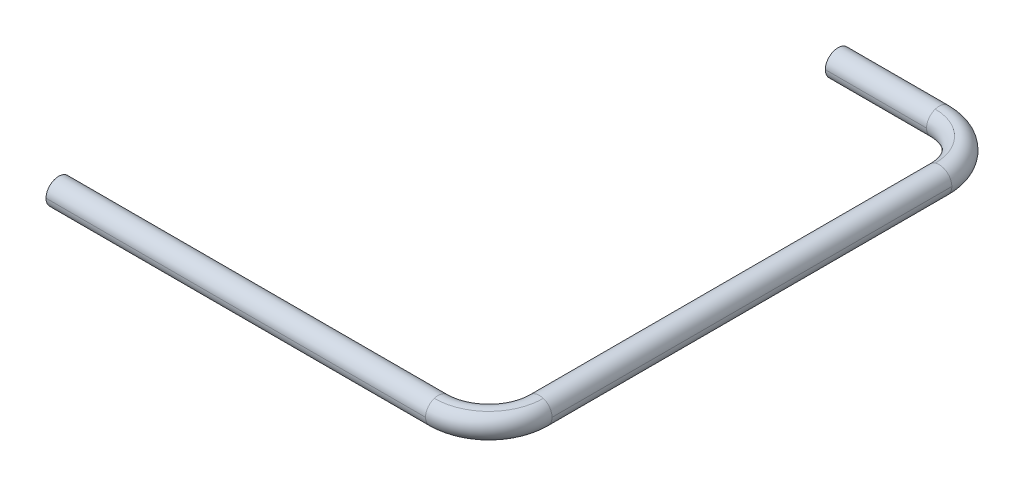
ISO-10303-21;
HEADER;
FILE_DESCRIPTION(('STEP AP214'),'2;1');
FILE_NAME('part.step','',(''),(''),'','','');
FILE_SCHEMA(('AUTOMOTIVE_DESIGN { 1 0 10303 214 1 1 1 1 }'));
ENDSEC;
DATA;
#1=APPLICATION_CONTEXT('core data for automotive mechanical design processes');
#2=APPLICATION_PROTOCOL_DEFINITION('international standard','automotive_design',2000,#1);
#3=PRODUCT_CONTEXT('',#1,'mechanical');
#4=PRODUCT('Part','Part','',(#3));
#5=PRODUCT_RELATED_PRODUCT_CATEGORY('part','',(#4));
#6=PRODUCT_DEFINITION_FORMATION('','',#4);
#7=PRODUCT_DEFINITION_CONTEXT('part definition',#1,'design');
#8=PRODUCT_DEFINITION('design','',#6,#7);
#9=PRODUCT_DEFINITION_SHAPE('','',#8);
#10=(LENGTH_UNIT() NAMED_UNIT(*) SI_UNIT(.MILLI.,.METRE.));
#11=(NAMED_UNIT(*) PLANE_ANGLE_UNIT() SI_UNIT($,.RADIAN.));
#12=(NAMED_UNIT(*) SI_UNIT($,.STERADIAN.) SOLID_ANGLE_UNIT());
#13=UNCERTAINTY_MEASURE_WITH_UNIT(LENGTH_MEASURE(1.E-05),#10,'distance_accuracy_value','');
#14=(GEOMETRIC_REPRESENTATION_CONTEXT(3) GLOBAL_UNCERTAINTY_ASSIGNED_CONTEXT((#13)) GLOBAL_UNIT_ASSIGNED_CONTEXT((#10,
#11,#12)) REPRESENTATION_CONTEXT('',''));
#15=CARTESIAN_POINT('',(0.,0.,0.));
#16=DIRECTION('',(0.,0.,1.));
#17=DIRECTION('',(1.,0.,0.));
#18=AXIS2_PLACEMENT_3D('',#15,#16,#17);
#19=CARTESIAN_POINT('',(0.,0.,0.));
#20=DIRECTION('',(1.,0.,0.));
#21=DIRECTION('',(0.,0.,-1.));
#22=AXIS2_PLACEMENT_3D('',#19,#20,#21);
#23=PLANE('',#22);
#24=CARTESIAN_POINT('',(0.,0.,0.));
#25=DIRECTION('',(1.,0.,0.));
#26=DIRECTION('',(0.,0.,-1.));
#27=AXIS2_PLACEMENT_3D('',#24,#25,#26);
#28=CIRCLE('',#27,2.5);
#29=CARTESIAN_POINT('',(0.,0.,2.5));
#30=VERTEX_POINT('',#29);
#31=CARTESIAN_POINT('',(0.,0.,-2.5));
#32=VERTEX_POINT('',#31);
#33=EDGE_CURVE('E11',#30,#32,#28,.T.);
#34=ORIENTED_EDGE('',*,*,#33,.F.);
#35=CARTESIAN_POINT('',(0.,0.,0.));
#36=DIRECTION('',(1.,0.,0.));
#37=DIRECTION('',(0.,0.,-1.));
#38=AXIS2_PLACEMENT_3D('',#35,#36,#37);
#39=CIRCLE('',#38,2.5);
#40=EDGE_CURVE('E25',#32,#30,#39,.T.);
#41=ORIENTED_EDGE('',*,*,#40,.F.);
#42=EDGE_LOOP('',(#34,#41));
#43=FACE_BOUND('',#42,.T.);
#44=ADVANCED_FACE('F17',(#43),#23,.F.);
#45=CARTESIAN_POINT('',(20.,0.,0.));
#46=DIRECTION('',(1.,0.,0.));
#47=DIRECTION('',(0.,-1.,0.));
#48=AXIS2_PLACEMENT_3D('',#45,#46,#47);
#49=CYLINDRICAL_SURFACE('',#48,2.5);
#50=DIRECTION('',(1.,0.,0.));
#51=VECTOR('',#50,1.);
#52=CARTESIAN_POINT('',(0.,0.,2.5));
#53=LINE('',#52,#51);
#54=CARTESIAN_POINT('',(20.,0.,2.5));
#55=VERTEX_POINT('',#54);
#56=EDGE_CURVE('E210',#30,#55,#53,.T.);
#57=ORIENTED_EDGE('',*,*,#56,.T.);
#58=CARTESIAN_POINT('',(20.,0.,0.));
#59=DIRECTION('',(1.,0.,0.));
#60=DIRECTION('',(0.,0.,-1.));
#61=AXIS2_PLACEMENT_3D('',#58,#59,#60);
#62=CIRCLE('',#61,2.5);
#63=CARTESIAN_POINT('',(20.,2.37764129073788,0.772542485937368));
#64=VERTEX_POINT('',#63);
#65=EDGE_CURVE('E205',#64,#55,#62,.T.);
#66=ORIENTED_EDGE('',*,*,#65,.F.);
#67=CARTESIAN_POINT('',(20.,0.,0.));
#68=DIRECTION('',(1.,0.,0.));
#69=DIRECTION('',(0.,0.,-1.));
#70=AXIS2_PLACEMENT_3D('',#67,#68,#69);
#71=CIRCLE('',#70,2.5);
#72=CARTESIAN_POINT('',(20.,0.,-2.5));
#73=VERTEX_POINT('',#72);
#74=EDGE_CURVE('E200',#73,#64,#71,.T.);
#75=ORIENTED_EDGE('',*,*,#74,.F.);
#76=DIRECTION('',(1.,0.,0.));
#77=VECTOR('',#76,1.);
#78=CARTESIAN_POINT('',(0.,0.,-2.5));
#79=LINE('',#78,#77);
#80=EDGE_CURVE('E195',#32,#73,#79,.T.);
#81=ORIENTED_EDGE('',*,*,#80,.F.);
#82=ORIENTED_EDGE('',*,*,#40,.T.);
#83=EDGE_LOOP('',(#57,#66,#75,#81,#82));
#84=FACE_BOUND('',#83,.T.);
#85=ADVANCED_FACE('F219',(#84),#49,.T.);
#86=CARTESIAN_POINT('',(20.,0.,0.));
#87=DIRECTION('',(1.,0.,0.));
#88=DIRECTION('',(0.,1.,0.));
#89=AXIS2_PLACEMENT_3D('',#86,#87,#88);
#90=CYLINDRICAL_SURFACE('',#89,2.5);
#91=ORIENTED_EDGE('',*,*,#56,.F.);
#92=ORIENTED_EDGE('',*,*,#33,.T.);
#93=ORIENTED_EDGE('',*,*,#80,.T.);
#94=CARTESIAN_POINT('',(20.,0.,0.));
#95=DIRECTION('',(1.,0.,0.));
#96=DIRECTION('',(0.,0.,-1.));
#97=AXIS2_PLACEMENT_3D('',#94,#95,#96);
#98=CIRCLE('',#97,2.5);
#99=CARTESIAN_POINT('',(20.,-2.37764129073788,-0.772542485937368));
#100=VERTEX_POINT('',#99);
#101=EDGE_CURVE('E190',#100,#73,#98,.T.);
#102=ORIENTED_EDGE('',*,*,#101,.F.);
#103=CARTESIAN_POINT('',(20.,0.,0.));
#104=DIRECTION('',(1.,0.,0.));
#105=DIRECTION('',(0.,0.,-1.));
#106=AXIS2_PLACEMENT_3D('',#103,#104,#105);
#107=CIRCLE('',#106,2.5);
#108=EDGE_CURVE('E186',#55,#100,#107,.T.);
#109=ORIENTED_EDGE('',*,*,#108,.F.);
#110=EDGE_LOOP('',(#91,#92,#93,#102,#109));
#111=FACE_BOUND('',#110,.T.);
#112=ADVANCED_FACE('F164',(#111),#90,.T.);
#113=CARTESIAN_POINT('',(20.,0.,10.));
#114=DIRECTION('',(0.,-1.,0.));
#115=DIRECTION('',(-0.707106781186548,0.,0.707106781186547));
#116=AXIS2_PLACEMENT_3D('',#113,#114,#115);
#117=TOROIDAL_SURFACE('',#116,10.,2.5);
#118=CARTESIAN_POINT('',(20.,2.37764129073788,10.));
#119=DIRECTION('',(0.,-1.,0.));
#120=DIRECTION('',(0.,0.,-1.));
#121=AXIS2_PLACEMENT_3D('',#118,#119,#120);
#122=CIRCLE('',#121,9.22745751406263);
#123=CARTESIAN_POINT('',(29.2274575140626,2.37764129073788,10.));
#124=VERTEX_POINT('',#123);
#125=EDGE_CURVE('E183',#64,#124,#122,.T.);
#126=ORIENTED_EDGE('',*,*,#125,.F.);
#127=ORIENTED_EDGE('',*,*,#65,.T.);
#128=ORIENTED_EDGE('',*,*,#108,.T.);
#129=CARTESIAN_POINT('',(20.,-2.37764129073788,-0.77254248593737));
#130=CARTESIAN_POINT('',(20.1762654922407,-2.37764129073788,-0.772546224965947));
#131=CARTESIAN_POINT('',(20.3525306663267,-2.37764129073788,-0.768216417356454));
#132=CARTESIAN_POINT('',(20.7046365464299,-2.37764129073788,-0.75091655610638));
#133=CARTESIAN_POINT('',(20.8804772524471,-2.37764129073788,-0.737946502465801));
#134=CARTESIAN_POINT('',(21.2313103646535,-2.37764129073788,-0.703392996398611));
#135=CARTESIAN_POINT('',(21.4063027708426,-2.37764129073788,-0.681809543972001));
#136=CARTESIAN_POINT('',(21.7550177692617,-2.37764129073788,-0.630082415401696));
#137=CARTESIAN_POINT('',(21.9287403614916,-2.37764129073788,-0.599938739258002));
#138=CARTESIAN_POINT('',(22.2744972035363,-2.37764129073788,-0.531163466193579));
#139=CARTESIAN_POINT('',(22.446531453351,-2.37764129073788,-0.492531869272851));
#140=CARTESIAN_POINT('',(22.7884971691463,-2.37764129073788,-0.406873906177727));
#141=CARTESIAN_POINT('',(22.9584286351268,-2.37764129073788,-0.359847540003329));
#142=CARTESIAN_POINT('',(23.2957794023539,-2.37764129073788,-0.257513306361434));
#143=CARTESIAN_POINT('',(23.4631987036005,-2.37764129073788,-0.202205438893935));
#144=CARTESIAN_POINT('',(23.7951218138974,-2.37764129073788,-0.0834414502385951));
#145=CARTESIAN_POINT('',(23.9596256229476,-2.37764129073788,-0.0199853290507542));
#146=CARTESIAN_POINT('',(24.285321444687,-2.37764129073788,0.11492229731919));
#147=CARTESIAN_POINT('',(24.4465134573761,-2.37764129073788,0.186373802501294));
#148=CARTESIAN_POINT('',(24.7651973607372,-2.37764129073788,0.337100063489158));
#149=CARTESIAN_POINT('',(24.9226892514093,-2.37764129073788,0.416374819294919));
#150=CARTESIAN_POINT('',(25.2335934989713,-2.37764129073788,0.582556601816592));
#151=CARTESIAN_POINT('',(25.3870058558613,-2.37764129073788,0.669463628532504));
#152=CARTESIAN_POINT('',(25.6893814520557,-2.37764129073788,0.85070058620365));
#153=CARTESIAN_POINT('',(25.83834469136,-2.37764129073788,0.945030517158884));
#154=CARTESIAN_POINT('',(26.1314631868916,-2.37764129073788,1.14088603425106));
#155=CARTESIAN_POINT('',(26.2756184431188,-2.37764129073788,1.24241162038801));
#156=CARTESIAN_POINT('',(26.5587736898574,-2.37764129073788,1.45241386381177));
#157=CARTESIAN_POINT('',(26.6977736803688,-2.37764129073788,1.56089052109859));
#158=CARTESIAN_POINT('',(26.9702835325237,-2.37764129073788,1.78453357705386));
#159=CARTESIAN_POINT('',(27.1037933941671,-2.37764129073788,1.89969997572231));
#160=CARTESIAN_POINT('',(27.3650013516353,-2.37764129073788,2.13644506849892));
#161=CARTESIAN_POINT('',(27.4926994474601,-2.37764129073788,2.25802376260707));
#162=CARTESIAN_POINT('',(27.741976237393,-2.37764129073788,2.50730055253996));
#163=CARTESIAN_POINT('',(27.8635549315011,-2.37764129073788,2.63499864836471));
#164=CARTESIAN_POINT('',(28.1003000242777,-2.37764129073788,2.89620660583292));
#165=CARTESIAN_POINT('',(28.2154664229462,-2.37764129073788,3.02971646747638));
#166=CARTESIAN_POINT('',(28.4391094789014,-2.37764129073788,3.30222631963124));
#167=CARTESIAN_POINT('',(28.5475861361883,-2.37764129073788,3.44122631014264));
#168=CARTESIAN_POINT('',(28.757588379612,-2.37764129073788,3.72438155688124));
#169=CARTESIAN_POINT('',(28.859113965749,-2.37764129073788,3.86853681310845));
#170=CARTESIAN_POINT('',(29.0549694828411,-2.37764129073788,4.16165530864002));
#171=CARTESIAN_POINT('',(29.1492994137964,-2.37764129073788,4.31061854794438));
#172=CARTESIAN_POINT('',(29.3305363714675,-2.37764129073788,4.61299414413872));
#173=CARTESIAN_POINT('',(29.4174433981834,-2.37764129073788,4.7664065010287));
#174=CARTESIAN_POINT('',(29.5836251807051,-2.37764129073788,5.07731074859074));
#175=CARTESIAN_POINT('',(29.6628999365109,-2.37764129073788,5.2348026392628));
#176=CARTESIAN_POINT('',(29.8136261974987,-2.37764129073788,5.55348654262397));
#177=CARTESIAN_POINT('',(29.8850777026808,-2.37764129073788,5.71467855531307));
#178=CARTESIAN_POINT('',(30.0199853290508,-2.37764129073788,6.04037437705243));
#179=CARTESIAN_POINT('',(30.0834414502386,-2.37764129073788,6.20487818610269));
#180=CARTESIAN_POINT('',(30.202205438894,-2.37764129073788,6.53680129639955));
#181=CARTESIAN_POINT('',(30.2575133063614,-2.37764129073788,6.70422059764615));
#182=CARTESIAN_POINT('',(30.3598475400033,-2.37764129073788,7.04157136487327));
#183=CARTESIAN_POINT('',(30.4068739061777,-2.37764129073788,7.21150283085379));
#184=CARTESIAN_POINT('',(30.4925318692729,-2.37764129073788,7.55346854664903));
#185=CARTESIAN_POINT('',(30.5311634661936,-2.37764129073788,7.72550279646375));
#186=CARTESIAN_POINT('',(30.599938739258,-2.37764129073788,8.07125963850841));
#187=CARTESIAN_POINT('',(30.6300824154017,-2.37764129073788,8.24498223073835));
#188=CARTESIAN_POINT('',(30.681809543972,-2.37764129073788,8.59369722915742));
#189=CARTESIAN_POINT('',(30.7033929963986,-2.37764129073788,8.76868963534656));
#190=CARTESIAN_POINT('',(30.7379465024658,-2.37764129073788,9.11952274755293));
#191=CARTESIAN_POINT('',(30.7509165561064,-2.37764129073788,9.29536345357016));
#192=CARTESIAN_POINT('',(30.7682164173565,-2.37764129073788,9.64746933367338));
#193=CARTESIAN_POINT('',(30.7725462249659,-2.37764129073788,9.82373450775935));
#194=CARTESIAN_POINT('',(30.7725424859374,-2.37764129073788,10.));
#195=B_SPLINE_CURVE_WITH_KNOTS('',3,(#129,#130,#131,#132,#133,#134,#135,#136,#137,#138,#139,
#140,#141,#142,#143,#144,#145,#146,#147,#148,#149,#150,#151,#152,#153,#154,#155,#156,#157,#158,
#159,#160,#161,#162,#163,#164,#165,#166,#167,#168,#169,#170,#171,#172,#173,#174,#175,#176,#177,
#178,#179,#180,#181,#182,#183,#184,#185,#186,#187,#188,#189,#190,#191,#192,#193,#194),
.UNSPECIFIED.,.F.,.F.,(4,2,2,2,2,2,2,2,2,2,2,2,2,2,2,2,2,2,2,2,2,2,2,2,2,2,2,2,2,2,2,2,4),(0.,
0.528742853840341,1.05748570768068,1.58622856152102,2.11497141536136,2.64371426920171,
3.17245712304205,3.70119997688239,4.22994283072273,4.75868568456307,5.28742853840341,
5.81617139224375,6.3449142460841,6.87365709992443,7.40239995376478,7.93114280760512,
8.45988566144546,8.9886285152858,9.51737136912614,10.0461142229665,10.5748570768068,
11.1035999306472,11.6323427844875,12.1610856383278,12.6898284921682,13.2185713460085,
13.7473141998489,14.2760570536892,14.8047999075295,15.3335427613699,15.8622856152102,
16.3910284690506,16.9197713228909),.UNSPECIFIED.);
#196=CARTESIAN_POINT('',(30.7725424859374,-2.37764129073788,10.));
#197=VERTEX_POINT('',#196);
#198=EDGE_CURVE('E181',#100,#197,#195,.T.);
#199=ORIENTED_EDGE('',*,*,#198,.T.);
#200=CARTESIAN_POINT('',(30.,0.,10.));
#201=DIRECTION('',(0.,0.,1.));
#202=DIRECTION('',(1.,0.,0.));
#203=AXIS2_PLACEMENT_3D('',#200,#201,#202);
#204=CIRCLE('',#203,2.5);
#205=CARTESIAN_POINT('',(27.5,0.,10.));
#206=VERTEX_POINT('',#205);
#207=EDGE_CURVE('E233',#206,#197,#204,.T.);
#208=ORIENTED_EDGE('',*,*,#207,.F.);
#209=CARTESIAN_POINT('',(30.,0.,10.));
#210=DIRECTION('',(0.,0.,1.));
#211=DIRECTION('',(1.,0.,0.));
#212=AXIS2_PLACEMENT_3D('',#209,#210,#211);
#213=CIRCLE('',#212,2.5);
#214=EDGE_CURVE('E224',#124,#206,#213,.T.);
#215=ORIENTED_EDGE('',*,*,#214,.F.);
#216=EDGE_LOOP('',(#126,#127,#128,#199,#208,#215));
#217=FACE_BOUND('',#216,.T.);
#218=ADVANCED_FACE('F159',(#217),#117,.T.);
#219=CARTESIAN_POINT('',(30.,0.,10.));
#220=DIRECTION('',(0.,0.,-1.));
#221=DIRECTION('',(0.,-1.,0.));
#222=AXIS2_PLACEMENT_3D('',#219,#220,#221);
#223=CYLINDRICAL_SURFACE('',#222,2.5);
#224=DIRECTION('',(0.,0.,-1.));
#225=VECTOR('',#224,1.);
#226=CARTESIAN_POINT('',(32.5,0.,89.));
#227=LINE('',#226,#225);
#228=CARTESIAN_POINT('',(32.5,0.,89.));
#229=VERTEX_POINT('',#228);
#230=CARTESIAN_POINT('',(32.5,0.,10.));
#231=VERTEX_POINT('',#230);
#232=EDGE_CURVE('E409',#229,#231,#227,.T.);
#233=ORIENTED_EDGE('',*,*,#232,.T.);
#234=CARTESIAN_POINT('',(30.,0.,10.));
#235=DIRECTION('',(0.,0.,1.));
#236=DIRECTION('',(1.,0.,0.));
#237=AXIS2_PLACEMENT_3D('',#234,#235,#236);
#238=CIRCLE('',#237,2.5);
#239=EDGE_CURVE('E405',#231,#124,#238,.T.);
#240=ORIENTED_EDGE('',*,*,#239,.T.);
#241=ORIENTED_EDGE('',*,*,#214,.T.);
#242=DIRECTION('',(0.,0.,-1.));
#243=VECTOR('',#242,1.);
#244=CARTESIAN_POINT('',(27.5,0.,89.));
#245=LINE('',#244,#243);
#246=CARTESIAN_POINT('',(27.5,0.,89.));
#247=VERTEX_POINT('',#246);
#248=EDGE_CURVE('E400',#247,#206,#245,.T.);
#249=ORIENTED_EDGE('',*,*,#248,.F.);
#250=CARTESIAN_POINT('',(30.,0.,89.));
#251=DIRECTION('',(0.,0.,-1.));
#252=DIRECTION('',(-1.,0.,0.));
#253=AXIS2_PLACEMENT_3D('',#250,#251,#252);
#254=CIRCLE('',#253,2.5);
#255=CARTESIAN_POINT('',(30.7725424859374,2.37764129073788,89.));
#256=VERTEX_POINT('',#255);
#257=EDGE_CURVE('E396',#247,#256,#254,.T.);
#258=ORIENTED_EDGE('',*,*,#257,.T.);
#259=CARTESIAN_POINT('',(30.,0.,89.));
#260=DIRECTION('',(0.,0.,-1.));
#261=DIRECTION('',(-1.,0.,0.));
#262=AXIS2_PLACEMENT_3D('',#259,#260,#261);
#263=CIRCLE('',#262,2.5);
#264=EDGE_CURVE('E384',#256,#229,#263,.T.);
#265=ORIENTED_EDGE('',*,*,#264,.T.);
#266=EDGE_LOOP('',(#233,#240,#241,#249,#258,#265));
#267=FACE_BOUND('',#266,.T.);
#268=ADVANCED_FACE('F154',(#267),#223,.T.);
#269=CARTESIAN_POINT('',(20.,0.,89.));
#270=DIRECTION('',(0.,1.,0.));
#271=DIRECTION('',(-0.707106781186547,0.,-0.707106781186548));
#272=AXIS2_PLACEMENT_3D('',#269,#270,#271);
#273=TOROIDAL_SURFACE('',#272,10.,2.5);
#274=CARTESIAN_POINT('',(20.,-2.37764129073788,89.));
#275=DIRECTION('',(0.,1.,0.));
#276=DIRECTION('',(0.,0.,1.));
#277=AXIS2_PLACEMENT_3D('',#274,#275,#276);
#278=CIRCLE('',#277,9.22745751406264);
#279=CARTESIAN_POINT('',(20.,-2.37764129073788,98.2274575140626));
#280=VERTEX_POINT('',#279);
#281=CARTESIAN_POINT('',(29.2274575140626,-2.37764129073788,89.));
#282=VERTEX_POINT('',#281);
#283=EDGE_CURVE('E115',#280,#282,#278,.T.);
#284=ORIENTED_EDGE('',*,*,#283,.T.);
#285=CARTESIAN_POINT('',(30.,0.,89.));
#286=DIRECTION('',(0.,0.,-1.));
#287=DIRECTION('',(-1.,0.,0.));
#288=AXIS2_PLACEMENT_3D('',#285,#286,#287);
#289=CIRCLE('',#288,2.5);
#290=EDGE_CURVE('E386',#229,#282,#289,.T.);
#291=ORIENTED_EDGE('',*,*,#290,.F.);
#292=ORIENTED_EDGE('',*,*,#264,.F.);
#293=CARTESIAN_POINT('',(20.,2.37764129073788,99.7725424859374));
#294=CARTESIAN_POINT('',(20.1762654922407,2.37764129073788,99.772546224966));
#295=CARTESIAN_POINT('',(20.3525306663267,2.37764129073788,99.7682164173564));
#296=CARTESIAN_POINT('',(20.7046365464299,2.37764129073788,99.7509165561064));
#297=CARTESIAN_POINT('',(20.8804772524471,2.37764129073788,99.7379465024658));
#298=CARTESIAN_POINT('',(21.2313103646535,2.37764129073788,99.7033929963986));
#299=CARTESIAN_POINT('',(21.4063027708426,2.37764129073788,99.681809543972));
#300=CARTESIAN_POINT('',(21.7550177692617,2.37764129073788,99.6300824154017));
#301=CARTESIAN_POINT('',(21.9287403614916,2.37764129073788,99.599938739258));
#302=CARTESIAN_POINT('',(22.2744972035363,2.37764129073788,99.5311634661936));
#303=CARTESIAN_POINT('',(22.446531453351,2.37764129073788,99.4925318692728));
#304=CARTESIAN_POINT('',(22.7884971691463,2.37764129073788,99.4068739061777));
#305=CARTESIAN_POINT('',(22.9584286351268,2.37764129073788,99.3598475400033));
#306=CARTESIAN_POINT('',(23.2957794023539,2.37764129073788,99.2575133063614));
#307=CARTESIAN_POINT('',(23.4631987036005,2.37764129073788,99.2022054388939));
#308=CARTESIAN_POINT('',(23.7951218138973,2.37764129073788,99.0834414502386));
#309=CARTESIAN_POINT('',(23.9596256229476,2.37764129073788,99.0199853290508));
#310=CARTESIAN_POINT('',(24.285321444687,2.37764129073788,98.8850777026808));
#311=CARTESIAN_POINT('',(24.4465134573761,2.37764129073788,98.8136261974987));
#312=CARTESIAN_POINT('',(24.7651973607372,2.37764129073788,98.6628999365108));
#313=CARTESIAN_POINT('',(24.9226892514093,2.37764129073788,98.5836251807051));
#314=CARTESIAN_POINT('',(25.2335934989713,2.37764129073788,98.4174433981834));
#315=CARTESIAN_POINT('',(25.3870058558613,2.37764129073788,98.3305363714675));
#316=CARTESIAN_POINT('',(25.6893814520557,2.37764129073788,98.1492994137964));
#317=CARTESIAN_POINT('',(25.83834469136,2.37764129073788,98.0549694828411));
#318=CARTESIAN_POINT('',(26.1314631868916,2.37764129073788,97.8591139657489));
#319=CARTESIAN_POINT('',(26.2756184431188,2.37764129073788,97.757588379612));
#320=CARTESIAN_POINT('',(26.5587736898574,2.37764129073788,97.5475861361882));
#321=CARTESIAN_POINT('',(26.6977736803688,2.37764129073788,97.4391094789014));
#322=CARTESIAN_POINT('',(26.9702835325237,2.37764129073788,97.2154664229461));
#323=CARTESIAN_POINT('',(27.1037933941671,2.37764129073788,97.1003000242777));
#324=CARTESIAN_POINT('',(27.3650013516353,2.37764129073788,96.8635549315011));
#325=CARTESIAN_POINT('',(27.4926994474601,2.37764129073788,96.7419762373929));
#326=CARTESIAN_POINT('',(27.741976237393,2.37764129073788,96.49269944746));
#327=CARTESIAN_POINT('',(27.8635549315011,2.37764129073788,96.3650013516353));
#328=CARTESIAN_POINT('',(28.1003000242777,2.37764129073788,96.1037933941671));
#329=CARTESIAN_POINT('',(28.2154664229462,2.37764129073788,95.9702835325236));
#330=CARTESIAN_POINT('',(28.4391094789014,2.37764129073788,95.6977736803688));
#331=CARTESIAN_POINT('',(28.5475861361883,2.37764129073788,95.5587736898574));
#332=CARTESIAN_POINT('',(28.757588379612,2.37764129073788,95.2756184431188));
#333=CARTESIAN_POINT('',(28.859113965749,2.37764129073788,95.1314631868916));
#334=CARTESIAN_POINT('',(29.0549694828411,2.37764129073788,94.83834469136));
#335=CARTESIAN_POINT('',(29.1492994137964,2.37764129073788,94.6893814520556));
#336=CARTESIAN_POINT('',(29.3305363714675,2.37764129073788,94.3870058558613));
#337=CARTESIAN_POINT('',(29.4174433981834,2.37764129073788,94.2335934989713));
#338=CARTESIAN_POINT('',(29.5836251807051,2.37764129073788,93.9226892514093));
#339=CARTESIAN_POINT('',(29.6628999365109,2.37764129073788,93.7651973607372));
#340=CARTESIAN_POINT('',(29.8136261974987,2.37764129073788,93.446513457376));
#341=CARTESIAN_POINT('',(29.8850777026808,2.37764129073788,93.2853214446869));
#342=CARTESIAN_POINT('',(30.0199853290508,2.37764129073788,92.9596256229476));
#343=CARTESIAN_POINT('',(30.0834414502386,2.37764129073788,92.7951218138973));
#344=CARTESIAN_POINT('',(30.2022054388939,2.37764129073788,92.4631987036005));
#345=CARTESIAN_POINT('',(30.2575133063614,2.37764129073788,92.2957794023539));
#346=CARTESIAN_POINT('',(30.3598475400033,2.37764129073788,91.9584286351267));
#347=CARTESIAN_POINT('',(30.4068739061777,2.37764129073788,91.7884971691462));
#348=CARTESIAN_POINT('',(30.4925318692729,2.37764129073788,91.446531453351));
#349=CARTESIAN_POINT('',(30.5311634661936,2.37764129073788,91.2744972035363));
#350=CARTESIAN_POINT('',(30.599938739258,2.37764129073788,90.9287403614916));
#351=CARTESIAN_POINT('',(30.6300824154017,2.37764129073788,90.7550177692617));
#352=CARTESIAN_POINT('',(30.681809543972,2.37764129073788,90.4063027708426));
#353=CARTESIAN_POINT('',(30.7033929963986,2.37764129073788,90.2313103646534));
#354=CARTESIAN_POINT('',(30.7379465024658,2.37764129073788,89.8804772524471));
#355=CARTESIAN_POINT('',(30.7509165561064,2.37764129073788,89.7046365464299));
#356=CARTESIAN_POINT('',(30.7682164173565,2.37764129073788,89.3525306663266));
#357=CARTESIAN_POINT('',(30.7725462249659,2.37764129073788,89.1762654922407));
#358=CARTESIAN_POINT('',(30.7725424859374,2.37764129073788,89.));
#359=B_SPLINE_CURVE_WITH_KNOTS('',3,(#293,#294,#295,#296,#297,#298,#299,#300,#301,#302,#303,
#304,#305,#306,#307,#308,#309,#310,#311,#312,#313,#314,#315,#316,#317,#318,#319,#320,#321,#322,
#323,#324,#325,#326,#327,#328,#329,#330,#331,#332,#333,#334,#335,#336,#337,#338,#339,#340,#341,
#342,#343,#344,#345,#346,#347,#348,#349,#350,#351,#352,#353,#354,#355,#356,#357,#358),
.UNSPECIFIED.,.F.,.F.,(4,2,2,2,2,2,2,2,2,2,2,2,2,2,2,2,2,2,2,2,2,2,2,2,2,2,2,2,2,2,2,2,4),(0.,
0.528742853840341,1.05748570768068,1.58622856152103,2.11497141536136,2.6437142692017,
3.17245712304204,3.70119997688238,4.22994283072272,4.75868568456306,5.2874285384034,
5.81617139224375,6.34491424608409,6.87365709992443,7.40239995376477,7.9311428076051,
8.45988566144544,8.98862851528579,9.51737136912612,10.0461142229665,10.5748570768068,
11.1035999306472,11.6323427844875,12.1610856383278,12.6898284921682,13.2185713460085,
13.7473141998488,14.2760570536892,14.8047999075295,15.3335427613699,15.8622856152102,
16.3910284690505,16.9197713228909),.UNSPECIFIED.);
#360=CARTESIAN_POINT('',(20.,2.37764129073788,99.7725424859374));
#361=VERTEX_POINT('',#360);
#362=EDGE_CURVE('E136',#361,#256,#359,.T.);
#363=ORIENTED_EDGE('',*,*,#362,.F.);
#364=CARTESIAN_POINT('',(20.,0.,99.));
#365=DIRECTION('',(1.,0.,0.));
#366=DIRECTION('',(0.,0.,-1.));
#367=AXIS2_PLACEMENT_3D('',#364,#365,#366);
#368=CIRCLE('',#367,2.5);
#369=CARTESIAN_POINT('',(20.,0.,101.5));
#370=VERTEX_POINT('',#369);
#371=EDGE_CURVE('E108',#361,#370,#368,.T.);
#372=ORIENTED_EDGE('',*,*,#371,.T.);
#373=CARTESIAN_POINT('',(20.,0.,99.));
#374=DIRECTION('',(1.,0.,0.));
#375=DIRECTION('',(0.,0.,-1.));
#376=AXIS2_PLACEMENT_3D('',#373,#374,#375);
#377=CIRCLE('',#376,2.5);
#378=EDGE_CURVE('E129',#370,#280,#377,.T.);
#379=ORIENTED_EDGE('',*,*,#378,.T.);
#380=EDGE_LOOP('',(#284,#291,#292,#363,#372,#379));
#381=FACE_BOUND('',#380,.T.);
#382=ADVANCED_FACE('F144',(#381),#273,.T.);
#383=CARTESIAN_POINT('',(20.,0.,99.));
#384=DIRECTION('',(1.,0.,0.));
#385=DIRECTION('',(0.,1.,0.));
#386=AXIS2_PLACEMENT_3D('',#383,#384,#385);
#387=CYLINDRICAL_SURFACE('',#386,2.5);
#388=DIRECTION('',(1.,0.,0.));
#389=VECTOR('',#388,1.);
#390=CARTESIAN_POINT('',(-55.,0.,101.5));
#391=LINE('',#390,#389);
#392=CARTESIAN_POINT('',(-55.,0.,101.5));
#393=VERTEX_POINT('',#392);
#394=EDGE_CURVE('E125',#393,#370,#391,.T.);
#395=ORIENTED_EDGE('',*,*,#394,.F.);
#396=CARTESIAN_POINT('',(-55.,0.,99.));
#397=DIRECTION('',(1.,0.,0.));
#398=DIRECTION('',(0.,0.,-1.));
#399=AXIS2_PLACEMENT_3D('',#396,#397,#398);
#400=CIRCLE('',#399,2.5);
#401=CARTESIAN_POINT('',(-55.,0.,96.5));
#402=VERTEX_POINT('',#401);
#403=EDGE_CURVE('E98',#393,#402,#400,.T.);
#404=ORIENTED_EDGE('',*,*,#403,.T.);
#405=DIRECTION('',(1.,0.,0.));
#406=VECTOR('',#405,1.);
#407=CARTESIAN_POINT('',(-55.,0.,96.5));
#408=LINE('',#407,#406);
#409=CARTESIAN_POINT('',(20.,0.,96.5));
#410=VERTEX_POINT('',#409);
#411=EDGE_CURVE('E90',#402,#410,#408,.T.);
#412=ORIENTED_EDGE('',*,*,#411,.T.);
#413=CARTESIAN_POINT('',(20.,0.,99.));
#414=DIRECTION('',(1.,0.,0.));
#415=DIRECTION('',(0.,0.,-1.));
#416=AXIS2_PLACEMENT_3D('',#413,#414,#415);
#417=CIRCLE('',#416,2.5);
#418=EDGE_CURVE('E95',#280,#410,#417,.T.);
#419=ORIENTED_EDGE('',*,*,#418,.F.);
#420=ORIENTED_EDGE('',*,*,#378,.F.);
#421=EDGE_LOOP('',(#395,#404,#412,#419,#420));
#422=FACE_BOUND('',#421,.T.);
#423=ADVANCED_FACE('F92',(#422),#387,.T.);
#424=CARTESIAN_POINT('',(20.,0.,89.));
#425=DIRECTION('',(0.,1.,0.));
#426=DIRECTION('',(-0.707106781186547,0.,-0.707106781186548));
#427=AXIS2_PLACEMENT_3D('',#424,#425,#426);
#428=TOROIDAL_SURFACE('',#427,10.,2.5);
#429=ORIENTED_EDGE('',*,*,#283,.F.);
#430=ORIENTED_EDGE('',*,*,#418,.T.);
#431=CARTESIAN_POINT('',(20.,0.,99.));
#432=DIRECTION('',(1.,0.,0.));
#433=DIRECTION('',(0.,0.,-1.));
#434=AXIS2_PLACEMENT_3D('',#431,#432,#433);
#435=CIRCLE('',#434,2.5);
#436=EDGE_CURVE('E105',#410,#361,#435,.T.);
#437=ORIENTED_EDGE('',*,*,#436,.T.);
#438=ORIENTED_EDGE('',*,*,#362,.T.);
#439=ORIENTED_EDGE('',*,*,#257,.F.);
#440=CARTESIAN_POINT('',(30.,0.,89.));
#441=DIRECTION('',(0.,0.,-1.));
#442=DIRECTION('',(-1.,0.,0.));
#443=AXIS2_PLACEMENT_3D('',#440,#441,#442);
#444=CIRCLE('',#443,2.5);
#445=EDGE_CURVE('E111',#282,#247,#444,.T.);
#446=ORIENTED_EDGE('',*,*,#445,.F.);
#447=EDGE_LOOP('',(#429,#430,#437,#438,#439,#446));
#448=FACE_BOUND('',#447,.T.);
#449=ADVANCED_FACE('F113',(#448),#428,.T.);
#450=CARTESIAN_POINT('',(30.,0.,10.));
#451=DIRECTION('',(0.,0.,-1.));
#452=DIRECTION('',(0.,1.,0.));
#453=AXIS2_PLACEMENT_3D('',#450,#451,#452);
#454=CYLINDRICAL_SURFACE('',#453,2.5);
#455=ORIENTED_EDGE('',*,*,#232,.F.);
#456=ORIENTED_EDGE('',*,*,#290,.T.);
#457=ORIENTED_EDGE('',*,*,#445,.T.);
#458=ORIENTED_EDGE('',*,*,#248,.T.);
#459=ORIENTED_EDGE('',*,*,#207,.T.);
#460=CARTESIAN_POINT('',(30.,0.,10.));
#461=DIRECTION('',(0.,0.,1.));
#462=DIRECTION('',(1.,0.,0.));
#463=AXIS2_PLACEMENT_3D('',#460,#461,#462);
#464=CIRCLE('',#463,2.5);
#465=EDGE_CURVE('E231',#197,#231,#464,.T.);
#466=ORIENTED_EDGE('',*,*,#465,.T.);
#467=EDGE_LOOP('',(#455,#456,#457,#458,#459,#466));
#468=FACE_BOUND('',#467,.T.);
#469=ADVANCED_FACE('F259',(#468),#454,.T.);
#470=CARTESIAN_POINT('',(20.,0.,10.));
#471=DIRECTION('',(0.,-1.,0.));
#472=DIRECTION('',(-0.707106781186548,0.,0.707106781186547));
#473=AXIS2_PLACEMENT_3D('',#470,#471,#472);
#474=TOROIDAL_SURFACE('',#473,10.,2.5);
#475=ORIENTED_EDGE('',*,*,#125,.T.);
#476=ORIENTED_EDGE('',*,*,#239,.F.);
#477=ORIENTED_EDGE('',*,*,#465,.F.);
#478=ORIENTED_EDGE('',*,*,#198,.F.);
#479=ORIENTED_EDGE('',*,*,#101,.T.);
#480=ORIENTED_EDGE('',*,*,#74,.T.);
#481=EDGE_LOOP('',(#475,#476,#477,#478,#479,#480));
#482=FACE_BOUND('',#481,.T.);
#483=ADVANCED_FACE('F228',(#482),#474,.T.);
#484=CARTESIAN_POINT('',(20.,0.,99.));
#485=DIRECTION('',(1.,0.,0.));
#486=DIRECTION('',(0.,-1.,0.));
#487=AXIS2_PLACEMENT_3D('',#484,#485,#486);
#488=CYLINDRICAL_SURFACE('',#487,2.5);
#489=ORIENTED_EDGE('',*,*,#394,.T.);
#490=ORIENTED_EDGE('',*,*,#371,.F.);
#491=ORIENTED_EDGE('',*,*,#436,.F.);
#492=ORIENTED_EDGE('',*,*,#411,.F.);
#493=CARTESIAN_POINT('',(-55.,0.,99.));
#494=DIRECTION('',(1.,0.,0.));
#495=DIRECTION('',(0.,0.,-1.));
#496=AXIS2_PLACEMENT_3D('',#493,#494,#495);
#497=CIRCLE('',#496,2.5);
#498=EDGE_CURVE('E241',#402,#393,#497,.T.);
#499=ORIENTED_EDGE('',*,*,#498,.T.);
#500=EDGE_LOOP('',(#489,#490,#491,#492,#499));
#501=FACE_BOUND('',#500,.T.);
#502=ADVANCED_FACE('F107',(#501),#488,.T.);
#503=CARTESIAN_POINT('',(-55.,0.,99.));
#504=DIRECTION('',(1.,0.,0.));
#505=DIRECTION('',(0.,0.,-1.));
#506=AXIS2_PLACEMENT_3D('',#503,#504,#505);
#507=PLANE('',#506);
#508=ORIENTED_EDGE('',*,*,#403,.F.);
#509=ORIENTED_EDGE('',*,*,#498,.F.);
#510=EDGE_LOOP('',(#508,#509));
#511=FACE_BOUND('',#510,.T.);
#512=ADVANCED_FACE('F267',(#511),#507,.F.);
#513=CLOSED_SHELL('',(#44,#85,#112,#218,#268,#382,#423,#449,#469,#483,#502,#512));
#514=MANIFOLD_SOLID_BREP('B1',#513);
#515=ADVANCED_BREP_SHAPE_REPRESENTATION('',(#18,#514),#14);
#516=SHAPE_DEFINITION_REPRESENTATION(#9,#515);
ENDSEC;
END-ISO-10303-21;
